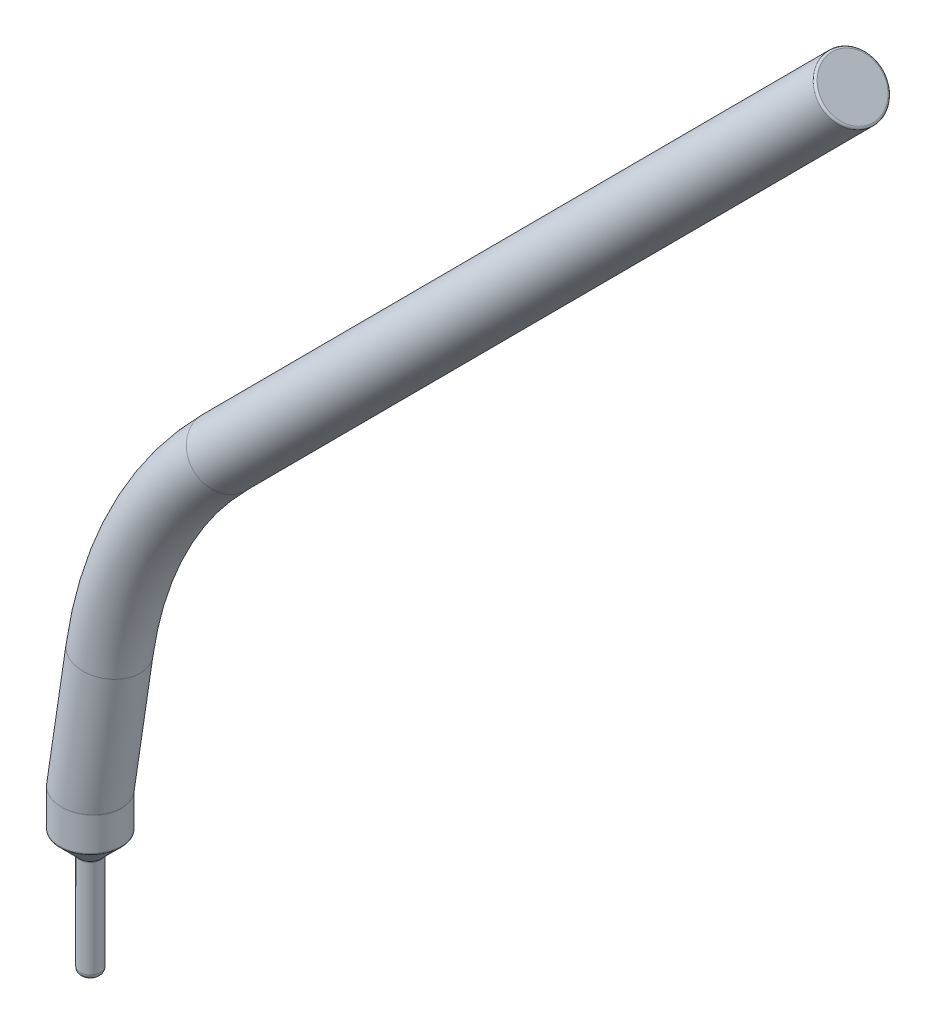
ISO-10303-21;
HEADER;
FILE_DESCRIPTION(('STEP AP214'),'2;1');
FILE_NAME('part.step','',(''),(''),'','','');
FILE_SCHEMA(('AUTOMOTIVE_DESIGN { 1 0 10303 214 1 1 1 1 }'));
ENDSEC;
DATA;
#1=APPLICATION_CONTEXT('core data for automotive mechanical design processes');
#2=APPLICATION_PROTOCOL_DEFINITION('international standard','automotive_design',2000,#1);
#3=PRODUCT_CONTEXT('',#1,'mechanical');
#4=PRODUCT('Part','Part','',(#3));
#5=PRODUCT_RELATED_PRODUCT_CATEGORY('part','',(#4));
#6=PRODUCT_DEFINITION_FORMATION('','',#4);
#7=PRODUCT_DEFINITION_CONTEXT('part definition',#1,'design');
#8=PRODUCT_DEFINITION('design','',#6,#7);
#9=PRODUCT_DEFINITION_SHAPE('','',#8);
#10=(LENGTH_UNIT() NAMED_UNIT(*) SI_UNIT(.MILLI.,.METRE.));
#11=(NAMED_UNIT(*) PLANE_ANGLE_UNIT() SI_UNIT($,.RADIAN.));
#12=(NAMED_UNIT(*) SI_UNIT($,.STERADIAN.) SOLID_ANGLE_UNIT());
#13=UNCERTAINTY_MEASURE_WITH_UNIT(LENGTH_MEASURE(1.E-05),#10,'distance_accuracy_value','');
#14=(GEOMETRIC_REPRESENTATION_CONTEXT(3) GLOBAL_UNCERTAINTY_ASSIGNED_CONTEXT((#13)) GLOBAL_UNIT_ASSIGNED_CONTEXT((#10,
#11,#12)) REPRESENTATION_CONTEXT('',''));
#15=CARTESIAN_POINT('',(0.,0.,0.));
#16=DIRECTION('',(0.,0.,1.));
#17=DIRECTION('',(1.,0.,0.));
#18=AXIS2_PLACEMENT_3D('',#15,#16,#17);
#19=CARTESIAN_POINT('',(36.887428435751,49.5443627096767,0.));
#20=DIRECTION('',(0.70580629971423,0.70840487525405,0.));
#21=DIRECTION('',(0.,0.,1.));
#22=AXIS2_PLACEMENT_3D('',#19,#20,#21);
#23=PLANE('',#22);
#24=CARTESIAN_POINT('',(36.887428435751,49.5443627096767,0.));
#25=DIRECTION('',(0.70580629971423,0.70840487525405,0.));
#26=DIRECTION('',(-0.70840487525405,0.70580629971423,0.));
#27=AXIS2_PLACEMENT_3D('',#24,#25,#26);
#28=CIRCLE('',#27,1.4);
#29=CARTESIAN_POINT('',(35.8956616103953,50.5324915292766,0.));
#30=VERTEX_POINT('',#29);
#31=EDGE_CURVE('E79',#30,#30,#28,.T.);
#32=ORIENTED_EDGE('',*,*,#31,.T.);
#33=EDGE_LOOP('',(#32));
#34=FACE_BOUND('',#33,.T.);
#35=ADVANCED_FACE('F38',(#34),#23,.T.);
#36=CARTESIAN_POINT('',(-0.0505273630641776,1.39602357689638,0.));
#37=DIRECTION('',(0.146962374015368,0.989142083132533,0.));
#38=DIRECTION('',(-0.989142083132533,0.146962374015368,0.));
#39=AXIS2_PLACEMENT_3D('',#36,#37,#38);
#40=CYLINDRICAL_SURFACE('',#39,1.5);
#41=CARTESIAN_POINT('',(0.,1.73610205951035,0.));
#42=DIRECTION('',(-0.0687969785165704,-0.997630681037322,0.));
#43=DIRECTION('',(-0.997630681037322,0.0687969785165704,0.));
#44=AXIS2_PLACEMENT_3D('',#41,#42,#43);
#45=ELLIPSE('',#44,1.50465078933412,1.5);
#46=CARTESIAN_POINT('',(0.,1.73610205951036,1.5));
#47=VERTEX_POINT('',#46);
#48=CARTESIAN_POINT('',(0.,1.73610205951036,-1.5));
#49=VERTEX_POINT('',#48);
#50=EDGE_CURVE('E52',#47,#49,#45,.F.);
#51=ORIENTED_EDGE('',*,*,#50,.T.);
#52=CARTESIAN_POINT('',(0.,1.73610205951035,0.));
#53=DIRECTION('',(-0.078567721598971,-0.996908778736925,0.));
#54=DIRECTION('',(-0.996908778736925,0.078567721598971,0.));
#55=AXIS2_PLACEMENT_3D('',#52,#53,#54);
#56=ELLIPSE('',#55,1.50356205129657,1.5);
#57=EDGE_CURVE('E57',#49,#47,#56,.F.);
#58=ORIENTED_EDGE('',*,*,#57,.T.);
#59=EDGE_LOOP('',(#51,#58));
#60=FACE_BOUND('',#59,.T.);
#61=CARTESIAN_POINT('',(0.925407966605008,7.9646348385154,0.));
#62=DIRECTION('',(0.146962374015368,0.989142083132533,0.));
#63=DIRECTION('',(0.,0.,1.));
#64=AXIS2_PLACEMENT_3D('',#61,#62,#63);
#65=CIRCLE('',#64,1.5);
#66=CARTESIAN_POINT('',(-0.558305158093794,8.18507839953845,0.));
#67=VERTEX_POINT('',#66);
#68=EDGE_CURVE('E134',#67,#67,#65,.T.);
#69=ORIENTED_EDGE('',*,*,#68,.F.);
#70=EDGE_LOOP('',(#69));
#71=FACE_BOUND('',#70,.T.);
#72=ADVANCED_FACE('F65',(#60,#71),#40,.T.);
#73=CARTESIAN_POINT('',(20.5077713627077,5.05517353604112,0.));
#74=DIRECTION('',(0.,0.,-1.));
#75=DIRECTION('',(-1.,0.,0.));
#76=AXIS2_PLACEMENT_3D('',#73,#74,#75);
#77=TOROIDAL_SURFACE('',#76,19.7973210623968,1.5);
#78=CARTESIAN_POINT('',(6.48325260513615,19.028247459346,0.));
#79=DIRECTION('',(0.70580629971423,0.70840487525405,0.));
#80=DIRECTION('',(0.,0.,1.));
#81=AXIS2_PLACEMENT_3D('',#78,#79,#80);
#82=CIRCLE('',#81,1.5);
#83=CARTESIAN_POINT('',(5.42064529225507,20.0869569089173,0.));
#84=VERTEX_POINT('',#83);
#85=EDGE_CURVE('E137',#84,#84,#82,.T.);
#86=CARTESIAN_POINT('',(20.5077713627077,5.05517353604112,0.));
#87=DIRECTION('',(0.,0.,-1.));
#88=DIRECTION('',(-1.,0.,0.));
#89=AXIS2_PLACEMENT_3D('',#86,#87,#88);
#90=CIRCLE('',#89,21.2973210623968);
#91=EDGE_CURVE('',#67,#84,#90,.T.);
#92=ORIENTED_EDGE('',*,*,#68,.T.);
#93=ORIENTED_EDGE('',*,*,#85,.F.);
#94=ORIENTED_EDGE('',*,*,#91,.T.);
#95=ORIENTED_EDGE('',*,*,#91,.F.);
#96=EDGE_LOOP('',(#92,#94,#93,#95));
#97=FACE_BOUND('',#96,.T.);
#98=ADVANCED_FACE('F107',(#97),#77,.T.);
#99=CARTESIAN_POINT('',(6.48325260513616,19.0282474593459,0.));
#100=DIRECTION('',(0.70580629971423,0.70840487525405,0.));
#101=DIRECTION('',(-0.70840487525405,0.70580629971423,0.));
#102=AXIS2_PLACEMENT_3D('',#99,#100,#101);
#103=CYLINDRICAL_SURFACE('',#102,1.5);
#104=CARTESIAN_POINT('',(36.8168478057796,49.4735222221513,0.));
#105=DIRECTION('',(0.70580629971423,0.70840487525405,0.));
#106=DIRECTION('',(-0.70840487525405,0.70580629971423,0.));
#107=AXIS2_PLACEMENT_3D('',#104,#105,#106);
#108=CIRCLE('',#107,1.5);
#109=CARTESIAN_POINT('',(35.7542404928985,50.5322316717226,0.));
#110=VERTEX_POINT('',#109);
#111=EDGE_CURVE('E82',#110,#110,#108,.F.);
#112=ORIENTED_EDGE('',*,*,#111,.T.);
#113=EDGE_LOOP('',(#112));
#114=FACE_BOUND('',#113,.T.);
#115=ORIENTED_EDGE('',*,*,#85,.T.);
#116=EDGE_LOOP('',(#115));
#117=FACE_BOUND('',#116,.T.);
#118=ADVANCED_FACE('F118',(#114,#117),#103,.T.);
#119=CARTESIAN_POINT('',(0.,0.,0.));
#120=DIRECTION('',(0.,1.,0.));
#121=DIRECTION('',(0.,0.,1.));
#122=AXIS2_PLACEMENT_3D('',#119,#120,#121);
#123=CYLINDRICAL_SURFACE('',#122,1.5);
#124=CARTESIAN_POINT('',(0.,0.0414213562373095,0.));
#125=DIRECTION('',(0.,-1.,0.));
#126=DIRECTION('',(0.,0.,-1.));
#127=AXIS2_PLACEMENT_3D('',#124,#125,#126);
#128=CIRCLE('',#127,1.5);
#129=CARTESIAN_POINT('',(0.,0.0414213562373095,-1.5));
#130=VERTEX_POINT('',#129);
#131=EDGE_CURVE('E71',#130,#130,#128,.F.);
#132=ORIENTED_EDGE('',*,*,#131,.T.);
#133=EDGE_LOOP('',(#132));
#134=FACE_BOUND('',#133,.T.);
#135=CARTESIAN_POINT('',(0.,1.73610205951035,0.));
#136=DIRECTION('',(-0.068793440990556,-0.997630924980115,0.));
#137=DIRECTION('',(-0.997630924980115,0.068793440990556,0.));
#138=AXIS2_PLACEMENT_3D('',#135,#136,#137);
#139=ELLIPSE('',#138,1.50356205129657,1.5);
#140=EDGE_CURVE('E60',#47,#49,#139,.T.);
#141=ORIENTED_EDGE('',*,*,#140,.T.);
#142=CARTESIAN_POINT('',(0.,1.73610205951035,0.));
#143=DIRECTION('',(-0.0785641866327079,-0.996909057326064,0.));
#144=DIRECTION('',(-0.996909057326064,0.0785641866327079,0.));
#145=AXIS2_PLACEMENT_3D('',#142,#143,#144);
#146=ELLIPSE('',#145,1.50465078933413,1.5);
#147=EDGE_CURVE('E67',#49,#47,#146,.T.);
#148=ORIENTED_EDGE('',*,*,#147,.T.);
#149=EDGE_LOOP('',(#141,#148));
#150=FACE_BOUND('',#149,.T.);
#151=ADVANCED_FACE('F70',(#134,#150),#123,.T.);
#152=CARTESIAN_POINT('',(0.,-1.,0.));
#153=DIRECTION('',(0.,1.,0.));
#154=DIRECTION('',(0.,0.,1.));
#155=AXIS2_PLACEMENT_3D('',#152,#153,#154);
#156=CONICAL_SURFACE('',#155,0.5,0.785398163397448);
#157=CARTESIAN_POINT('',(0.,-0.970710678118655,0.));
#158=DIRECTION('',(0.,-1.,0.));
#159=DIRECTION('',(0.,0.,-1.));
#160=AXIS2_PLACEMENT_3D('',#157,#158,#159);
#161=CIRCLE('',#160,0.529289321881345);
#162=CARTESIAN_POINT('',(0.,-0.970710678118655,-0.529289321881345));
#163=VERTEX_POINT('',#162);
#164=EDGE_CURVE('E12',#163,#163,#161,.F.);
#165=ORIENTED_EDGE('',*,*,#164,.T.);
#166=EDGE_LOOP('',(#165));
#167=FACE_BOUND('',#166,.T.);
#168=CARTESIAN_POINT('',(0.,-0.0292893218813452,0.));
#169=DIRECTION('',(0.,-1.,0.));
#170=DIRECTION('',(0.,0.,-1.));
#171=AXIS2_PLACEMENT_3D('',#168,#169,#170);
#172=CIRCLE('',#171,1.47071067811865);
#173=CARTESIAN_POINT('',(0.,-0.0292893218813452,-1.47071067811865));
#174=VERTEX_POINT('',#173);
#175=EDGE_CURVE('E63',#174,#174,#172,.T.);
#176=ORIENTED_EDGE('',*,*,#175,.T.);
#177=EDGE_LOOP('',(#176));
#178=FACE_BOUND('',#177,.T.);
#179=ADVANCED_FACE('F111',(#167,#178),#156,.T.);
#180=CARTESIAN_POINT('',(0.,-6.,0.));
#181=DIRECTION('',(0.,1.,0.));
#182=DIRECTION('',(0.,0.,1.));
#183=AXIS2_PLACEMENT_3D('',#180,#181,#182);
#184=CYLINDRICAL_SURFACE('',#183,0.5);
#185=CARTESIAN_POINT('',(0.,-1.04142135623731,0.));
#186=DIRECTION('',(0.,-1.,0.));
#187=DIRECTION('',(0.,0.,-1.));
#188=AXIS2_PLACEMENT_3D('',#185,#186,#187);
#189=CIRCLE('',#188,0.5);
#190=CARTESIAN_POINT('',(0.,-1.04142135623731,-0.5));
#191=VERTEX_POINT('',#190);
#192=EDGE_CURVE('E46',#191,#191,#189,.T.);
#193=ORIENTED_EDGE('',*,*,#192,.T.);
#194=EDGE_LOOP('',(#193));
#195=FACE_BOUND('',#194,.T.);
#196=CARTESIAN_POINT('',(0.,-5.75,0.));
#197=DIRECTION('',(0.,-1.,0.));
#198=DIRECTION('',(0.,0.,-1.));
#199=AXIS2_PLACEMENT_3D('',#196,#197,#198);
#200=CIRCLE('',#199,0.5);
#201=CARTESIAN_POINT('',(0.,-5.75,-0.5));
#202=VERTEX_POINT('',#201);
#203=EDGE_CURVE('E127',#202,#202,#200,.F.);
#204=ORIENTED_EDGE('',*,*,#203,.T.);
#205=EDGE_LOOP('',(#204));
#206=FACE_BOUND('',#205,.T.);
#207=ADVANCED_FACE('F115',(#195,#206),#184,.T.);
#208=CARTESIAN_POINT('',(0.,-6.,0.));
#209=DIRECTION('',(0.,-1.,0.));
#210=DIRECTION('',(0.,0.,-1.));
#211=AXIS2_PLACEMENT_3D('',#208,#209,#210);
#212=PLANE('',#211);
#213=CARTESIAN_POINT('',(0.,-6.,0.));
#214=DIRECTION('',(0.,-1.,0.));
#215=DIRECTION('',(0.,0.,-1.));
#216=AXIS2_PLACEMENT_3D('',#213,#214,#215);
#217=CIRCLE('',#216,0.25);
#218=CARTESIAN_POINT('',(0.,-6.,-0.25));
#219=VERTEX_POINT('',#218);
#220=EDGE_CURVE('E129',#219,#219,#217,.T.);
#221=ORIENTED_EDGE('',*,*,#220,.T.);
#222=EDGE_LOOP('',(#221));
#223=FACE_BOUND('',#222,.T.);
#224=ADVANCED_FACE('F213',(#223),#212,.T.);
#225=CARTESIAN_POINT('',(0.,-5.75,0.));
#226=DIRECTION('',(0.,-1.,0.));
#227=DIRECTION('',(0.,0.,-1.));
#228=AXIS2_PLACEMENT_3D('',#225,#226,#227);
#229=DEGENERATE_TOROIDAL_SURFACE('',#228,0.25,0.25,.T.);
#230=ORIENTED_EDGE('',*,*,#203,.F.);
#231=EDGE_LOOP('',(#230));
#232=FACE_BOUND('',#231,.T.);
#233=ORIENTED_EDGE('',*,*,#220,.F.);
#234=EDGE_LOOP('',(#233));
#235=FACE_BOUND('',#234,.T.);
#236=ADVANCED_FACE('F96',(#232,#235),#229,.T.);
#237=CARTESIAN_POINT('',(0.,1.73610205951035,1.5));
#238=CARTESIAN_POINT('',(0.,1.73610205951035,1.5));
#239=CARTESIAN_POINT('',(0.,1.73610205951035,1.5));
#240=CARTESIAN_POINT('',(0.0654992975694139,1.7315852038709,1.50002560872682));
#241=CARTESIAN_POINT('',(0.0654761800495219,1.73126452932931,1.50002655299903));
#242=CARTESIAN_POINT('',(0.0654519194693862,1.73094393923963,1.50002560872682));
#243=CARTESIAN_POINT('',(0.130993073831933,1.7270687289828,1.49571732586059));
#244=CARTESIAN_POINT('',(0.130947851657299,1.72642733224227,1.49571416689898));
#245=CARTESIAN_POINT('',(0.130898321625646,1.72578625377608,1.49571732586059));
#246=CARTESIAN_POINT('',(0.260862995964707,1.71811285140932,1.47861804237312));
#247=CARTESIAN_POINT('',(0.260768087036725,1.71683591584805,1.47860233347986));
#248=CARTESIAN_POINT('',(0.260674303969908,1.71555889710557,1.47861804237312));
#249=CARTESIAN_POINT('',(0.325239243780531,1.71367344169374,1.46582781972693));
#250=CARTESIAN_POINT('',(0.325120552142196,1.71208140830138,1.46580263272881));
#251=CARTESIAN_POINT('',(0.325003986029738,1.71048921787031,1.46582781972693));
#252=CARTESIAN_POINT('',(0.451768726673671,1.70494792203824,1.43195266087458));
#253=CARTESIAN_POINT('',(0.451595159024036,1.70273717460504,1.43190556118996));
#254=CARTESIAN_POINT('',(0.451441945399429,1.70052492336984,1.43195266087458));
#255=CARTESIAN_POINT('',(0.513922353664233,1.70066178507186,1.41086919495662));
#256=CARTESIAN_POINT('',(0.5137208634273,1.69814718524033,1.41080775855557));
#257=CARTESIAN_POINT('',(0.513550614339051,1.69563027724117,1.41086919495662));
#258=CARTESIAN_POINT('',(0.63494380001637,1.69231610164112,1.36077568277395));
#259=CARTESIAN_POINT('',(0.634679354081031,1.68921049484776,1.36068589799572));
#260=CARTESIAN_POINT('',(0.634484521337279,1.68609974487233,1.36077568277395));
#261=CARTESIAN_POINT('',(0.693812439247923,1.68825649863823,1.33176762508753));
#262=CARTESIAN_POINT('',(0.693515086616509,1.68486357614162,1.33166139118044));
#263=CARTESIAN_POINT('',(0.693310578672819,1.68146379406678,1.33176762508753));
#264=CARTESIAN_POINT('',(0.807255923967902,1.68043339422747,1.26631864127877));
#265=CARTESIAN_POINT('',(0.806886865317301,1.67648740940848,1.26618275430782));
#266=CARTESIAN_POINT('',(0.806672005462927,1.67253003202917,1.26631864127877));
#267=CARTESIAN_POINT('',(0.861832083019866,1.67666980223579,1.22988000138603));
#268=CARTESIAN_POINT('',(0.861425129244303,1.67245799752818,1.22972835288247));
#269=CARTESIAN_POINT('',(0.861208687530883,1.66823211735297,1.22988000138603));
#270=CARTESIAN_POINT('',(0.965756360837397,1.66950314583251,1.1501936828948));
#271=CARTESIAN_POINT('',(0.965270127029725,1.66478569119391,1.15001632184206));
#272=CARTESIAN_POINT('',(0.965057793018138,1.66004800021091,1.15019368289481));
#273=CARTESIAN_POINT('',(1.01510626573048,1.66609995824891,1.10694834320212));
#274=CARTESIAN_POINT('',(1.01457830554061,1.66114269000572,1.10675881288642));
#275=CARTESIAN_POINT('',(1.01437200127298,1.65616165708612,1.10694834320212));
#276=CARTESIAN_POINT('',(1.10773316514605,1.65971237321341,1.01438844246846));
#277=CARTESIAN_POINT('',(1.1071215195788,1.65430538534589,1.01418205108865));
#278=CARTESIAN_POINT('',(1.10693190017605,1.64886721721853,1.01438844246846));
#279=CARTESIAN_POINT('',(1.15101231061204,1.65672782743165,0.965076042743848));
#280=CARTESIAN_POINT('',(1.15035728026044,1.65111102829819,0.964863501849439));
#281=CARTESIAN_POINT('',(1.15017974021192,1.64545895108726,0.965076042743848));
#282=CARTESIAN_POINT('',(1.2307568506811,1.65122861463254,0.861226075798424));
#283=CARTESIAN_POINT('',(1.23001853446435,1.64522547234212,0.861009236762736));
#284=CARTESIAN_POINT('',(1.22986659806244,1.63917900696765,0.861226075798425));
#285=CARTESIAN_POINT('',(1.26722457968493,1.64871378663405,0.806690308453468));
#286=CARTESIAN_POINT('',(1.26644416599082,1.64253426323769,0.806474945160325));
#287=CARTESIAN_POINT('',(1.2663079485893,1.63630714514344,0.806690308453469));
#288=CARTESIAN_POINT('',(1.33272218836187,1.64419704746125,0.693327154738446));
#289=CARTESIAN_POINT('',(1.33186474715818,1.63770084082943,0.693122005608468));
#290=CARTESIAN_POINT('',(1.33175818038785,1.6311491578743,0.693327154738446));
#291=CARTESIAN_POINT('',(1.36175435577017,1.64219497852387,0.634501095557126));
#292=CARTESIAN_POINT('',(1.36085943663863,1.63555864674686,0.634305560408188));
#293=CARTESIAN_POINT('',(1.36076934773994,1.62886285226846,0.634501095557126));
#294=CARTESIAN_POINT('',(1.41188421441135,1.63873800504307,0.513564421277562));
#295=CARTESIAN_POINT('',(1.41092466317573,1.63185971311617,0.513393464941111));
#296=CARTESIAN_POINT('',(1.41086294557306,1.62491508718363,0.513564421277563));
#297=CARTESIAN_POINT('',(1.4329839006433,1.63728296292378,0.451454636516148));
#298=CARTESIAN_POINT('',(1.43199475481502,1.63030300647652,0.451300760205539));
#299=CARTESIAN_POINT('',(1.43194736961011,1.62325347059692,0.451454636516148));
#300=CARTESIAN_POINT('',(1.4668881483011,1.63494491354131,0.325013755420425));
#301=CARTESIAN_POINT('',(1.46585233864029,1.62780153061937,0.324896571278511));
#302=CARTESIAN_POINT('',(1.4658270930532,1.62058348490857,0.325013755420426));
#303=CARTESIAN_POINT('',(1.47969418590376,1.63406180448044,0.260683056532222));
#304=CARTESIAN_POINT('',(1.47863940141725,1.62685679312761,0.260588645788027));
#305=CARTESIAN_POINT('',(1.47862386756828,1.61957499955686,0.260683056532223));
#306=CARTESIAN_POINT('',(1.49679261522299,1.6328826905088,0.130901502554888));
#307=CARTESIAN_POINT('',(1.49571336072948,1.62559532989899,0.130851855782714));
#308=CARTESIAN_POINT('',(1.4957099289519,1.61822848504233,0.130901502554888));
#309=CARTESIAN_POINT('',(1.50108579168675,1.63258663148159,0.0654507512774443));
#310=CARTESIAN_POINT('',(1.5,1.62527862316945,0.0654269537159065));
#311=CARTESIAN_POINT('',(1.5,1.61789039408005,0.0654507512774443));
#312=CARTESIAN_POINT('',(1.50108579168675,1.63258663148159,-0.0654507512774439));
#313=CARTESIAN_POINT('',(1.5,1.62527862316945,-0.0654269537159062));
#314=CARTESIAN_POINT('',(1.5,1.61789039408005,-0.065450751277444));
#315=CARTESIAN_POINT('',(1.49679261522299,1.6328826905088,-0.130901502554888));
#316=CARTESIAN_POINT('',(1.49571336072948,1.62559532989899,-0.130851855782714));
#317=CARTESIAN_POINT('',(1.4957099289519,1.61822848504233,-0.130901502554888));
#318=CARTESIAN_POINT('',(1.47969418590376,1.63406180448044,-0.260683056532222));
#319=CARTESIAN_POINT('',(1.47863940141725,1.62685679312761,-0.260588645788027));
#320=CARTESIAN_POINT('',(1.47862386756828,1.61957499955686,-0.260683056532222));
#321=CARTESIAN_POINT('',(1.4668881483011,1.63494491354131,-0.325013755420425));
#322=CARTESIAN_POINT('',(1.46585233864029,1.62780153061937,-0.324896571278511));
#323=CARTESIAN_POINT('',(1.4658270930532,1.62058348490857,-0.325013755420425));
#324=CARTESIAN_POINT('',(1.4329839006433,1.63728296292378,-0.451454636516148));
#325=CARTESIAN_POINT('',(1.43199475481502,1.63030300647652,-0.451300760205539));
#326=CARTESIAN_POINT('',(1.43194736961011,1.62325347059692,-0.451454636516148));
#327=CARTESIAN_POINT('',(1.41188421441135,1.63873800504307,-0.513564421277562));
#328=CARTESIAN_POINT('',(1.41092466317573,1.63185971311617,-0.513393464941111));
#329=CARTESIAN_POINT('',(1.41086294557306,1.62491508718363,-0.513564421277562));
#330=CARTESIAN_POINT('',(1.36175435577017,1.64219497852387,-0.634501095557125));
#331=CARTESIAN_POINT('',(1.36085943663864,1.63555864674686,-0.634305560408188));
#332=CARTESIAN_POINT('',(1.36076934773994,1.62886285226846,-0.634501095557126));
#333=CARTESIAN_POINT('',(1.33272218836187,1.64419704746125,-0.693327154738445));
#334=CARTESIAN_POINT('',(1.33186474715818,1.63770084082943,-0.693122005608468));
#335=CARTESIAN_POINT('',(1.33175818038785,1.6311491578743,-0.693327154738446));
#336=CARTESIAN_POINT('',(1.26722457968493,1.64871378663405,-0.806690308453468));
#337=CARTESIAN_POINT('',(1.26644416599082,1.64253426323769,-0.806474945160325));
#338=CARTESIAN_POINT('',(1.2663079485893,1.63630714514344,-0.806690308453469));
#339=CARTESIAN_POINT('',(1.2307568506811,1.65122861463254,-0.861226075798424));
#340=CARTESIAN_POINT('',(1.23001853446435,1.64522547234212,-0.861009236762736));
#341=CARTESIAN_POINT('',(1.22986659806244,1.63917900696765,-0.861226075798424));
#342=CARTESIAN_POINT('',(1.15101231061204,1.65672782743165,-0.965076042743847));
#343=CARTESIAN_POINT('',(1.15035728026044,1.65111102829819,-0.964863501849439));
#344=CARTESIAN_POINT('',(1.15017974021192,1.64545895108726,-0.965076042743848));
#345=CARTESIAN_POINT('',(1.10773316514606,1.65971237321341,-1.01438844246846));
#346=CARTESIAN_POINT('',(1.1071215195788,1.65430538534589,-1.01418205108865));
#347=CARTESIAN_POINT('',(1.10693190017605,1.64886721721853,-1.01438844246846));
#348=CARTESIAN_POINT('',(1.01510626573048,1.66609995824891,-1.10694834320212));
#349=CARTESIAN_POINT('',(1.01457830554061,1.66114269000572,-1.10675881288642));
#350=CARTESIAN_POINT('',(1.01437200127298,1.65616165708612,-1.10694834320212));
#351=CARTESIAN_POINT('',(0.965756360837398,1.66950314583251,-1.1501936828948));
#352=CARTESIAN_POINT('',(0.965270127029725,1.66478569119391,-1.15001632184206));
#353=CARTESIAN_POINT('',(0.965057793018139,1.66004800021091,-1.1501936828948));
#354=CARTESIAN_POINT('',(0.861832083019867,1.67666980223579,-1.22988000138603));
#355=CARTESIAN_POINT('',(0.861425129244303,1.67245799752818,-1.22972835288247));
#356=CARTESIAN_POINT('',(0.861208687530884,1.66823211735297,-1.22988000138603));
#357=CARTESIAN_POINT('',(0.807255923967903,1.68043339422747,-1.26631864127877));
#358=CARTESIAN_POINT('',(0.806886865317302,1.67648740940848,-1.26618275430782));
#359=CARTESIAN_POINT('',(0.806672005462928,1.67253003202917,-1.26631864127877));
#360=CARTESIAN_POINT('',(0.693812439247924,1.68825649863823,-1.33176762508753));
#361=CARTESIAN_POINT('',(0.69351508661651,1.68486357614162,-1.33166139118044));
#362=CARTESIAN_POINT('',(0.69331057867282,1.68146379406678,-1.33176762508753));
#363=CARTESIAN_POINT('',(0.63494380001637,1.69231610164112,-1.36077568277395));
#364=CARTESIAN_POINT('',(0.634679354081031,1.68921049484776,-1.36068589799572));
#365=CARTESIAN_POINT('',(0.634484521337279,1.68609974487233,-1.36077568277395));
#366=CARTESIAN_POINT('',(0.513922353664233,1.70066178507186,-1.41086919495662));
#367=CARTESIAN_POINT('',(0.5137208634273,1.69814718524033,-1.41080775855557));
#368=CARTESIAN_POINT('',(0.513550614339051,1.69563027724117,-1.41086919495662));
#369=CARTESIAN_POINT('',(0.451768726673671,1.70494792203824,-1.43195266087458));
#370=CARTESIAN_POINT('',(0.451595159024036,1.70273717460504,-1.43190556118996));
#371=CARTESIAN_POINT('',(0.451441945399429,1.70052492336984,-1.43195266087458));
#372=CARTESIAN_POINT('',(0.325239243780531,1.71367344169374,-1.46582781972693));
#373=CARTESIAN_POINT('',(0.325120552142197,1.71208140830138,-1.46580263272881));
#374=CARTESIAN_POINT('',(0.325003986029738,1.71048921787031,-1.46582781972693));
#375=CARTESIAN_POINT('',(0.260862995964707,1.71811285140932,-1.47861804237312));
#376=CARTESIAN_POINT('',(0.260768087036725,1.71683591584805,-1.47860233347986));
#377=CARTESIAN_POINT('',(0.260674303969908,1.71555889710557,-1.47861804237312));
#378=CARTESIAN_POINT('',(0.130993073831933,1.7270687289828,-1.49571732586059));
#379=CARTESIAN_POINT('',(0.130947851657299,1.72642733224227,-1.49571416689898));
#380=CARTESIAN_POINT('',(0.130898321625646,1.72578625377608,-1.49571732586059));
#381=CARTESIAN_POINT('',(0.0654992975694137,1.7315852038709,-1.50002560872682));
#382=CARTESIAN_POINT('',(0.0654761800495216,1.73126452932931,-1.50002655299903));
#383=CARTESIAN_POINT('',(0.0654519194693864,1.73094393923963,-1.50002560872682));
#384=CARTESIAN_POINT('',(0.,1.73610205951035,-1.5));
#385=CARTESIAN_POINT('',(0.,1.73610205951035,-1.5));
#386=CARTESIAN_POINT('',(0.,1.73610205951035,-1.5));
#387=(BOUNDED_SURFACE() B_SPLINE_SURFACE(3,2,((#237,#238,#239),(#240,#241,#242),(#243,#244,
#245),(#246,#247,#248),(#249,#250,#251),(#252,#253,#254),(#255,#256,#257),(#258,#259,#260),
(#261,#262,#263),(#264,#265,#266),(#267,#268,#269),(#270,#271,#272),(#273,#274,#275),(#276,#277,
#278),(#279,#280,#281),(#282,#283,#284),(#285,#286,#287),(#288,#289,#290),(#291,#292,#293),
(#294,#295,#296),(#297,#298,#299),(#300,#301,#302),(#303,#304,#305),(#306,#307,#308),(#309,#310,
#311),(#312,#313,#314),(#315,#316,#317),(#318,#319,#320),(#321,#322,#323),(#324,#325,#326),
(#327,#328,#329),(#330,#331,#332),(#333,#334,#335),(#336,#337,#338),(#339,#340,#341),(#342,#343,
#344),(#345,#346,#347),(#348,#349,#350),(#351,#352,#353),(#354,#355,#356),(#357,#358,#359),
(#360,#361,#362),(#363,#364,#365),(#366,#367,#368),(#369,#370,#371),(#372,#373,#374),(#375,#376,
#377),(#378,#379,#380),(#381,#382,#383),(#384,#385,#386)),.UNSPECIFIED.,.F.,.F.,
.F.) B_SPLINE_SURFACE_WITH_KNOTS((4,2,2,2,2,2,2,2,2,2,2,2,2,2,2,2,2,2,2,2,2,2,2,2,4),(3,3),(0.,
0.209858013859547,0.419696781918629,0.62949836494652,0.839247349145239,1.04893189522216,
1.25854454654443,1.46808274095123,1.67754899037134,1.88695071466515,2.09629973966551,
2.30561149262998,2.51490394956176,2.72419640649354,2.93350815945801,3.14285718445837,
3.35225890875218,3.56172515817229,3.77126335257909,3.98087600390135,4.19056054997828,
4.400309534177,4.61011111720489,4.81994988526397,5.02980789912352),(0.,1.),
.UNSPECIFIED.) GEOMETRIC_REPRESENTATION_ITEM() RATIONAL_B_SPLINE_SURFACE(((1.,1.,1.),(1.,
1.00000036562459,1.),(1.,0.999984506591815,1.),(1.,0.999923000453401,1.),(1.,0.999877356079722,
1.),(1.,0.999758950085206,1.),(1.,0.999686193271187,1.),(1.,0.999518617092525,1.),(1.,
0.999423803263703,1.),(1.,0.999218527826973,1.),(1.,0.999108071035253,1.),(1.,0.998879034963298,
1.),(1.,0.998760458481015,1.),(1.,0.998523259833723,1.),(1.,0.998404637699903,1.),(1.,
0.998175439483443,1.),(1.,0.998064860652174,1.),(1.,0.997859299005412,1.),(1.,0.99776431139613,
1.),(1.,0.997596423108818,1.),(1.,0.997523516878273,1.),(1.,0.997404775935885,1.),(1.,
0.997358936406598,1.),(1.,0.997297463105605,1.),(1.,0.99728182654968,1.),(1.,0.99728182654968,
1.),(1.,0.997297463105605,1.),(1.,0.997358936406598,1.),(1.,0.997404775935885,1.),(1.,
0.997523516878273,1.),(1.,0.997596423108818,1.),(1.,0.99776431139613,1.),(1.,0.997859299005412,
1.),(1.,0.998064860652174,1.),(1.,0.998175439483443,1.),(1.,0.998404637699903,1.),(1.,
0.998523259833723,1.),(1.,0.998760458481015,1.),(1.,0.998879034963298,1.),(1.,0.999108071035253,
1.),(1.,0.999218527826973,1.),(1.,0.999423803263703,1.),(1.,0.999518617092525,1.),(1.,
0.999686193271187,1.),(1.,0.999758950085206,1.),(1.,0.999877356079722,1.),(1.,0.999923000453401,
1.),(1.,0.999984506591815,1.),(1.,1.00000036562459,1.),(1.,1.,1.))) REPRESENTATION_ITEM('') SURFACE());
#388=ORIENTED_EDGE('',*,*,#147,.F.);
#389=ORIENTED_EDGE('',*,*,#50,.F.);
#390=EDGE_LOOP('',(#388,#389));
#391=FACE_BOUND('',#390,.T.);
#392=ADVANCED_FACE('F73',(#391),#387,.F.);
#393=CARTESIAN_POINT('',(0.,1.73610205951035,-1.5));
#394=CARTESIAN_POINT('',(0.,1.73610205951035,-1.5));
#395=CARTESIAN_POINT('',(0.,1.73610205951035,-1.5));
#396=CARTESIAN_POINT('',(-0.0654519194693874,1.74061541474723,-1.50002560872682));
#397=CARTESIAN_POINT('',(-0.0654286625026012,1.74093607898617,-1.50002620216242));
#398=CARTESIAN_POINT('',(-0.0654045413693595,1.74125667937851,-1.50002560872682));
#399=CARTESIAN_POINT('',(-0.130898321625647,1.74512838952783,-1.49571732586059));
#400=CARTESIAN_POINT('',(-0.130853068680427,1.74576978399496,-1.49572036289291));
#401=CARTESIAN_POINT('',(-0.13080356941936,1.74641086473455,-1.49571732586059));
#402=CARTESIAN_POINT('',(-0.260674303969909,1.75407732661453,-1.47861804237312));
#403=CARTESIAN_POINT('',(-0.260584226213979,1.75535461911386,-1.47863282144833));
#404=CARTESIAN_POINT('',(-0.260485611975109,1.75663128091828,-1.47861804237312));
#405=CARTESIAN_POINT('',(-0.325003986029738,1.75851329594538,-1.46582781972693));
#406=CARTESIAN_POINT('',(-0.324894876085151,1.76010603725522,-1.46585086622674));
#407=CARTESIAN_POINT('',(-0.324768728278945,1.76169751976881,-1.46582781972693));
#408=CARTESIAN_POINT('',(-0.45144194539943,1.76723205363329,-1.43195266087458));
#409=CARTESIAN_POINT('',(-0.45129624934036,1.76944486028346,-1.43199788929821));
#410=CARTESIAN_POINT('',(-0.451115164125188,1.77165505230169,-1.43195266087458));
#411=CARTESIAN_POINT('',(-0.513550614339052,1.77151486899588,-1.41086919495662));
#412=CARTESIAN_POINT('',(-0.513390532753061,1.7740325281934,-1.41092643643523));
#413=CARTESIAN_POINT('',(-0.51317887501387,1.77654637682657,-1.41086919495662));
#414=CARTESIAN_POINT('',(-0.63448452133728,1.77985408481861,-1.36077568277395));
#415=CARTESIAN_POINT('',(-0.634299794796436,1.78296558146346,-1.3608612646567));
#416=CARTESIAN_POINT('',(-0.634025242658188,1.7860704415874,-1.36077568277395));
#417=CARTESIAN_POINT('',(-0.69331057867282,1.78391054177347,-1.33176762508753));
#418=CARTESIAN_POINT('',(-0.693117717493238,1.78731118433793,-1.33186709777245));
#419=CARTESIAN_POINT('',(-0.692808718097716,1.79070324634492,-1.33176762508753));
#420=CARTESIAN_POINT('',(-0.806672005462927,1.79172758355638,-1.26631864127877));
#421=CARTESIAN_POINT('',(-0.806468784968457,1.79568582087827,-1.26644784527289));
#422=CARTESIAN_POINT('',(-0.806088086957953,1.79963094575469,-1.26631864127877));
#423=CARTESIAN_POINT('',(-0.861208687530883,1.79548825889805,-1.22988000138603));
#424=CARTESIAN_POINT('',(-0.861004145665153,1.79971501826127,-1.2300224893538));
#425=CARTESIAN_POINT('',(-0.8605852920419,1.80392594378087,-1.22988000138603));
#426=CARTESIAN_POINT('',(-0.965057793018138,1.80264936139736,-1.15019368289481));
#427=CARTESIAN_POINT('',(-0.964857368311941,1.80738793226713,-1.15036193505201));
#428=CARTESIAN_POINT('',(-0.96435922519888,1.81210450701896,-1.15019368289481));
#429=CARTESIAN_POINT('',(-1.01437200127298,1.80604991163155,-1.10694834320212));
#430=CARTESIAN_POINT('',(-1.01417667338716,1.81103175551138,-1.10712685850184));
#431=CARTESIAN_POINT('',(-1.01363773681548,1.81598821279434,-1.10694834320212));
#432=CARTESIAN_POINT('',(-1.10693190017605,1.81243254651569,-1.01438844246846));
#433=CARTESIAN_POINT('',(-1.10675328933084,1.81787152798051,-1.01458386391993));
#434=CARTESIAN_POINT('',(-1.10613063520605,1.82327770251058,-1.01438844246846));
#435=CARTESIAN_POINT('',(-1.15017974021192,1.81541477938055,-0.965076042743848));
#436=CARTESIAN_POINT('',(-1.15001132404463,1.82106753068474,-0.965276650801408));
#437=CARTESIAN_POINT('',(-1.14934716981179,1.82668365572495,-0.965076042743848));
#438=CARTESIAN_POINT('',(-1.22986659806244,1.82090973048522,-0.861226075798424));
#439=CARTESIAN_POINT('',(-1.22972383314649,1.82695687347008,-0.861431004672094));
#440=CARTESIAN_POINT('',(-1.22897634544379,1.83295933815011,-0.861226075798425));
#441=CARTESIAN_POINT('',(-1.2663079485893,1.8234226095814,-0.806690308453469));
#442=CARTESIAN_POINT('',(-1.26617844436561,1.8296502236606,-0.806893997436784));
#443=CARTESIAN_POINT('',(-1.26539131749368,1.83582925107201,-0.80669030845347));
#444=CARTESIAN_POINT('',(-1.33175818038785,1.82793584844189,-0.693327154738446));
#445=CARTESIAN_POINT('',(-1.3316583819685,1.83448803145829,-0.693520627475114));
#446=CARTESIAN_POINT('',(-1.33079417241384,1.84098373802884,-0.693327154738447));
#447=CARTESIAN_POINT('',(-1.36076934773994,1.829936365847,-0.634501095557125));
#448=CARTESIAN_POINT('',(-1.36068344712481,1.83663246976539,-0.63468646934751));
#449=CARTESIAN_POINT('',(-1.3597843397097,1.84326849210242,-0.634501095557126));
#450=CARTESIAN_POINT('',(-1.41086294557306,1.83339066029623,-0.513564421277562));
#451=CARTESIAN_POINT('',(-1.41080546936666,1.84033559959285,-0.513725187915757));
#452=CARTESIAN_POINT('',(-1.40984167673476,1.84721357815568,-0.513564421277562));
#453=CARTESIAN_POINT('',(-1.43194736961011,1.8348445748096,-0.451454636516148));
#454=CARTESIAN_POINT('',(-1.43190198010969,1.84189425813642,-0.45160101237753));
#455=CARTESIAN_POINT('',(-1.43091083857692,1.84887406713647,-0.451454636516149));
#456=CARTESIAN_POINT('',(-1.4658270930532,1.83718081228691,-0.325013755420426));
#457=CARTESIAN_POINT('',(-1.46580388489812,1.84439900852785,-0.325123388134373));
#458=CARTESIAN_POINT('',(-1.46476603780531,1.85154224091965,-0.325013755420426));
#459=CARTESIAN_POINT('',(-1.47862386756828,1.83806323696965,-0.260683056532222));
#460=CARTESIAN_POINT('',(-1.47860884883522,1.84534506859834,-0.260773500741003));
#461=CARTESIAN_POINT('',(-1.47755354923279,1.85255004189323,-0.260683056532223));
#462=CARTESIAN_POINT('',(-1.4957099289519,1.83924143716987,-0.130901502554888));
#463=CARTESIAN_POINT('',(-1.49570703520847,1.84660832177773,-0.130947116389971));
#464=CARTESIAN_POINT('',(-1.49462724268081,1.85389564263635,-0.130901502554888));
#465=CARTESIAN_POINT('',(-1.5,1.83953726676186,-0.065450751277444));
#466=CARTESIAN_POINT('',(-1.5,1.84692549585125,-0.0654745847663387));
#467=CARTESIAN_POINT('',(-1.49891420831325,1.8542335041634,-0.065450751277444));
#468=CARTESIAN_POINT('',(-1.5,1.83953726676186,0.065450751277444));
#469=CARTESIAN_POINT('',(-1.5,1.84692549585125,0.0654745847663387));
#470=CARTESIAN_POINT('',(-1.49891420831325,1.8542335041634,0.065450751277444));
#471=CARTESIAN_POINT('',(-1.4957099289519,1.83924143716987,0.130901502554888));
#472=CARTESIAN_POINT('',(-1.49570703520847,1.84660832177773,0.130947116389971));
#473=CARTESIAN_POINT('',(-1.49462724268081,1.85389564263635,0.130901502554888));
#474=CARTESIAN_POINT('',(-1.47862386756828,1.83806323696965,0.260683056532222));
#475=CARTESIAN_POINT('',(-1.47860884883522,1.84534506859834,0.260773500741003));
#476=CARTESIAN_POINT('',(-1.47755354923279,1.85255004189323,0.260683056532222));
#477=CARTESIAN_POINT('',(-1.4658270930532,1.83718081228691,0.325013755420425));
#478=CARTESIAN_POINT('',(-1.46580388489812,1.84439900852785,0.325123388134372));
#479=CARTESIAN_POINT('',(-1.46476603780531,1.85154224091965,0.325013755420425));
#480=CARTESIAN_POINT('',(-1.43194736961011,1.8348445748096,0.451454636516148));
#481=CARTESIAN_POINT('',(-1.43190198010969,1.84189425813642,0.451601012377529));
#482=CARTESIAN_POINT('',(-1.43091083857692,1.84887406713647,0.451454636516148));
#483=CARTESIAN_POINT('',(-1.41086294557306,1.83339066029623,0.513564421277562));
#484=CARTESIAN_POINT('',(-1.41080546936666,1.84033559959285,0.513725187915757));
#485=CARTESIAN_POINT('',(-1.40984167673476,1.84721357815568,0.513564421277562));
#486=CARTESIAN_POINT('',(-1.36076934773994,1.829936365847,0.634501095557125));
#487=CARTESIAN_POINT('',(-1.36068344712481,1.83663246976539,0.63468646934751));
#488=CARTESIAN_POINT('',(-1.3597843397097,1.84326849210242,0.634501095557126));
#489=CARTESIAN_POINT('',(-1.33175818038785,1.82793584844189,0.693327154738445));
#490=CARTESIAN_POINT('',(-1.3316583819685,1.83448803145829,0.693520627475114));
#491=CARTESIAN_POINT('',(-1.33079417241384,1.84098373802884,0.693327154738446));
#492=CARTESIAN_POINT('',(-1.2663079485893,1.8234226095814,0.806690308453468));
#493=CARTESIAN_POINT('',(-1.26617844436561,1.8296502236606,0.806893997436784));
#494=CARTESIAN_POINT('',(-1.26539131749368,1.83582925107201,0.806690308453469));
#495=CARTESIAN_POINT('',(-1.22986659806244,1.82090973048522,0.861226075798424));
#496=CARTESIAN_POINT('',(-1.22972383314649,1.82695687347008,0.861431004672093));
#497=CARTESIAN_POINT('',(-1.22897634544379,1.83295933815011,0.861226075798424));
#498=CARTESIAN_POINT('',(-1.15017974021192,1.81541477938055,0.965076042743847));
#499=CARTESIAN_POINT('',(-1.15001132404463,1.82106753068474,0.965276650801408));
#500=CARTESIAN_POINT('',(-1.1493471698118,1.82668365572495,0.965076042743848));
#501=CARTESIAN_POINT('',(-1.10693190017605,1.81243254651569,1.01438844246846));
#502=CARTESIAN_POINT('',(-1.10675328933084,1.81787152798051,1.01458386391993));
#503=CARTESIAN_POINT('',(-1.10613063520605,1.82327770251058,1.01438844246846));
#504=CARTESIAN_POINT('',(-1.01437200127298,1.80604991163155,1.10694834320212));
#505=CARTESIAN_POINT('',(-1.01417667338716,1.81103175551138,1.10712685850184));
#506=CARTESIAN_POINT('',(-1.01363773681548,1.81598821279434,1.10694834320212));
#507=CARTESIAN_POINT('',(-0.965057793018139,1.80264936139736,1.1501936828948));
#508=CARTESIAN_POINT('',(-0.964857368311942,1.80738793226713,1.15036193505201));
#509=CARTESIAN_POINT('',(-0.96435922519888,1.81210450701896,1.15019368289481));
#510=CARTESIAN_POINT('',(-0.861208687530884,1.79548825889805,1.22988000138603));
#511=CARTESIAN_POINT('',(-0.861004145665154,1.79971501826127,1.2300224893538));
#512=CARTESIAN_POINT('',(-0.860585292041901,1.80392594378087,1.22988000138603));
#513=CARTESIAN_POINT('',(-0.806672005462928,1.79172758355638,1.26631864127877));
#514=CARTESIAN_POINT('',(-0.806468784968457,1.79568582087827,1.26644784527289));
#515=CARTESIAN_POINT('',(-0.806088086957953,1.79963094575469,1.26631864127877));
#516=CARTESIAN_POINT('',(-0.693310578672821,1.78391054177347,1.33176762508753));
#517=CARTESIAN_POINT('',(-0.693117717493239,1.78731118433793,1.33186709777245));
#518=CARTESIAN_POINT('',(-0.692808718097717,1.79070324634492,1.33176762508753));
#519=CARTESIAN_POINT('',(-0.63448452133728,1.77985408481861,1.36077568277395));
#520=CARTESIAN_POINT('',(-0.634299794796436,1.78296558146346,1.3608612646567));
#521=CARTESIAN_POINT('',(-0.634025242658189,1.7860704415874,1.36077568277395));
#522=CARTESIAN_POINT('',(-0.513550614339053,1.77151486899588,1.41086919495662));
#523=CARTESIAN_POINT('',(-0.513390532753062,1.7740325281934,1.41092643643523));
#524=CARTESIAN_POINT('',(-0.513178875013871,1.77654637682657,1.41086919495662));
#525=CARTESIAN_POINT('',(-0.451441945399431,1.76723205363329,1.43195266087458));
#526=CARTESIAN_POINT('',(-0.45129624934036,1.76944486028346,1.43199788929821));
#527=CARTESIAN_POINT('',(-0.451115164125188,1.77165505230169,1.43195266087458));
#528=CARTESIAN_POINT('',(-0.325003986029739,1.75851329594538,1.46582781972693));
#529=CARTESIAN_POINT('',(-0.324894876085151,1.76010603725522,1.46585086622674));
#530=CARTESIAN_POINT('',(-0.324768728278945,1.76169751976881,1.46582781972693));
#531=CARTESIAN_POINT('',(-0.260674303969909,1.75407732661453,1.47861804237312));
#532=CARTESIAN_POINT('',(-0.260584226213979,1.75535461911386,1.47863282144833));
#533=CARTESIAN_POINT('',(-0.26048561197511,1.75663128091828,1.47861804237312));
#534=CARTESIAN_POINT('',(-0.130898321625648,1.74512838952783,1.49571732586059));
#535=CARTESIAN_POINT('',(-0.130853068680428,1.74576978399496,1.49572036289291));
#536=CARTESIAN_POINT('',(-0.130803569419361,1.74641086473455,1.49571732586059));
#537=CARTESIAN_POINT('',(-0.0654519194693877,1.74061541474723,1.50002560872682));
#538=CARTESIAN_POINT('',(-0.0654286625026016,1.74093607898617,1.50002620216242));
#539=CARTESIAN_POINT('',(-0.0654045413693599,1.74125667937851,1.50002560872682));
#540=CARTESIAN_POINT('',(0.,1.73610205951035,1.5));
#541=CARTESIAN_POINT('',(0.,1.73610205951035,1.5));
#542=CARTESIAN_POINT('',(0.,1.73610205951035,1.5));
#543=(BOUNDED_SURFACE() B_SPLINE_SURFACE(3,2,((#393,#394,#395),(#396,#397,#398),(#399,#400,
#401),(#402,#403,#404),(#405,#406,#407),(#408,#409,#410),(#411,#412,#413),(#414,#415,#416),
(#417,#418,#419),(#420,#421,#422),(#423,#424,#425),(#426,#427,#428),(#429,#430,#431),(#432,#433,
#434),(#435,#436,#437),(#438,#439,#440),(#441,#442,#443),(#444,#445,#446),(#447,#448,#449),
(#450,#451,#452),(#453,#454,#455),(#456,#457,#458),(#459,#460,#461),(#462,#463,#464),(#465,#466,
#467),(#468,#469,#470),(#471,#472,#473),(#474,#475,#476),(#477,#478,#479),(#480,#481,#482),
(#483,#484,#485),(#486,#487,#488),(#489,#490,#491),(#492,#493,#494),(#495,#496,#497),(#498,#499,
#500),(#501,#502,#503),(#504,#505,#506),(#507,#508,#509),(#510,#511,#512),(#513,#514,#515),
(#516,#517,#518),(#519,#520,#521),(#522,#523,#524),(#525,#526,#527),(#528,#529,#530),(#531,#532,
#533),(#534,#535,#536),(#537,#538,#539),(#540,#541,#542)),.UNSPECIFIED.,.F.,.F.,
.F.) B_SPLINE_SURFACE_WITH_KNOTS((4,2,2,2,2,2,2,2,2,2,2,2,2,2,2,2,2,2,2,2,2,2,2,2,4),(3,3),(0.,
0.183625762127103,0.3672346841788,0.550811069328205,0.734341430502085,0.917815408319392,
1.10122647822638,1.28457239833233,1.46785536657492,1.651081875332,1.83426227220732,
2.01741005605124,2.20054095586654,2.38367185568184,2.56681963952576,2.75000003640108,
2.93322654515816,3.11650951340075,3.2998554335067,3.48326650341369,3.666740481231,
3.85027084240487,4.03384722755428,4.21745614960598,4.40108191173308),(0.,1.),
.UNSPECIFIED.) GEOMETRIC_REPRESENTATION_ITEM() RATIONAL_B_SPLINE_SURFACE(((1.,1.,1.),(1.,
1.00000036562459,1.),(1.,0.999984506591815,1.),(1.,0.999923000453401,1.),(1.,0.999877356079721,
1.),(1.,0.999758950085206,1.),(1.,0.999686193271187,1.),(1.,0.999518617092525,1.),(1.,
0.999423803263703,1.),(1.,0.999218527826973,1.),(1.,0.999108071035253,1.),(1.,0.998879034963298,
1.),(1.,0.998760458481015,1.),(1.,0.998523259833723,1.),(1.,0.998404637699903,1.),(1.,
0.998175439483443,1.),(1.,0.998064860652174,1.),(1.,0.997859299005412,1.),(1.,0.99776431139613,
1.),(1.,0.997596423108818,1.),(1.,0.997523516878273,1.),(1.,0.997404775935885,1.),(1.,
0.997358936406598,1.),(1.,0.997297463105606,1.),(1.,0.99728182654968,1.),(1.,0.99728182654968,
1.),(1.,0.997297463105606,1.),(1.,0.997358936406598,1.),(1.,0.997404775935885,1.),(1.,
0.997523516878274,1.),(1.,0.997596423108818,1.),(1.,0.99776431139613,1.),(1.,0.997859299005412,
1.),(1.,0.998064860652174,1.),(1.,0.998175439483443,1.),(1.,0.998404637699903,1.),(1.,
0.998523259833723,1.),(1.,0.998760458481015,1.),(1.,0.998879034963298,1.),(1.,0.999108071035253,
1.),(1.,0.999218527826973,1.),(1.,0.999423803263703,1.),(1.,0.999518617092525,1.),(1.,
0.999686193271187,1.),(1.,0.999758950085206,1.),(1.,0.999877356079722,1.),(1.,0.999923000453401,
1.),(1.,0.999984506591815,1.),(1.,1.00000036562459,1.),(1.,1.,1.))) REPRESENTATION_ITEM('') SURFACE());
#544=ORIENTED_EDGE('',*,*,#140,.F.);
#545=ORIENTED_EDGE('',*,*,#57,.F.);
#546=EDGE_LOOP('',(#544,#545));
#547=FACE_BOUND('',#546,.T.);
#548=ADVANCED_FACE('F58',(#547),#543,.T.);
#549=CARTESIAN_POINT('',(0.,0.0414213562373095,0.));
#550=DIRECTION('',(0.,-1.,0.));
#551=DIRECTION('',(0.,0.,-1.));
#552=AXIS2_PLACEMENT_3D('',#549,#550,#551);
#553=TOROIDAL_SURFACE('',#552,1.4,0.1);
#554=ORIENTED_EDGE('',*,*,#175,.F.);
#555=EDGE_LOOP('',(#554));
#556=FACE_BOUND('',#555,.T.);
#557=ORIENTED_EDGE('',*,*,#131,.F.);
#558=EDGE_LOOP('',(#557));
#559=FACE_BOUND('',#558,.T.);
#560=ADVANCED_FACE('F179',(#556,#559),#553,.T.);
#561=CARTESIAN_POINT('',(36.8168478057796,49.4735222221513,0.));
#562=DIRECTION('',(0.70580629971423,0.70840487525405,0.));
#563=DIRECTION('',(-0.70840487525405,0.70580629971423,0.));
#564=AXIS2_PLACEMENT_3D('',#561,#562,#563);
#565=TOROIDAL_SURFACE('',#564,1.4,0.1);
#566=ORIENTED_EDGE('',*,*,#111,.F.);
#567=EDGE_LOOP('',(#566));
#568=FACE_BOUND('',#567,.T.);
#569=ORIENTED_EDGE('',*,*,#31,.F.);
#570=EDGE_LOOP('',(#569));
#571=FACE_BOUND('',#570,.T.);
#572=ADVANCED_FACE('F188',(#568,#571),#565,.T.);
#573=CARTESIAN_POINT('',(0.,-1.04142135623731,0.));
#574=DIRECTION('',(0.,-1.,0.));
#575=DIRECTION('',(0.,0.,-1.));
#576=AXIS2_PLACEMENT_3D('',#573,#574,#575);
#577=TOROIDAL_SURFACE('',#576,0.6,0.1);
#578=ORIENTED_EDGE('',*,*,#164,.F.);
#579=EDGE_LOOP('',(#578));
#580=FACE_BOUND('',#579,.T.);
#581=ORIENTED_EDGE('',*,*,#192,.F.);
#582=EDGE_LOOP('',(#581));
#583=FACE_BOUND('',#582,.T.);
#584=ADVANCED_FACE('F40',(#580,#583),#577,.F.);
#585=CLOSED_SHELL('',(#35,#72,#98,#118,#151,#179,#207,#224,#236,#392,#548,#560,#572,#584));
#586=MANIFOLD_SOLID_BREP('B2',#585);
#587=ADVANCED_BREP_SHAPE_REPRESENTATION('',(#18,#586),#14);
#588=SHAPE_DEFINITION_REPRESENTATION(#9,#587);
ENDSEC;
END-ISO-10303-21;
